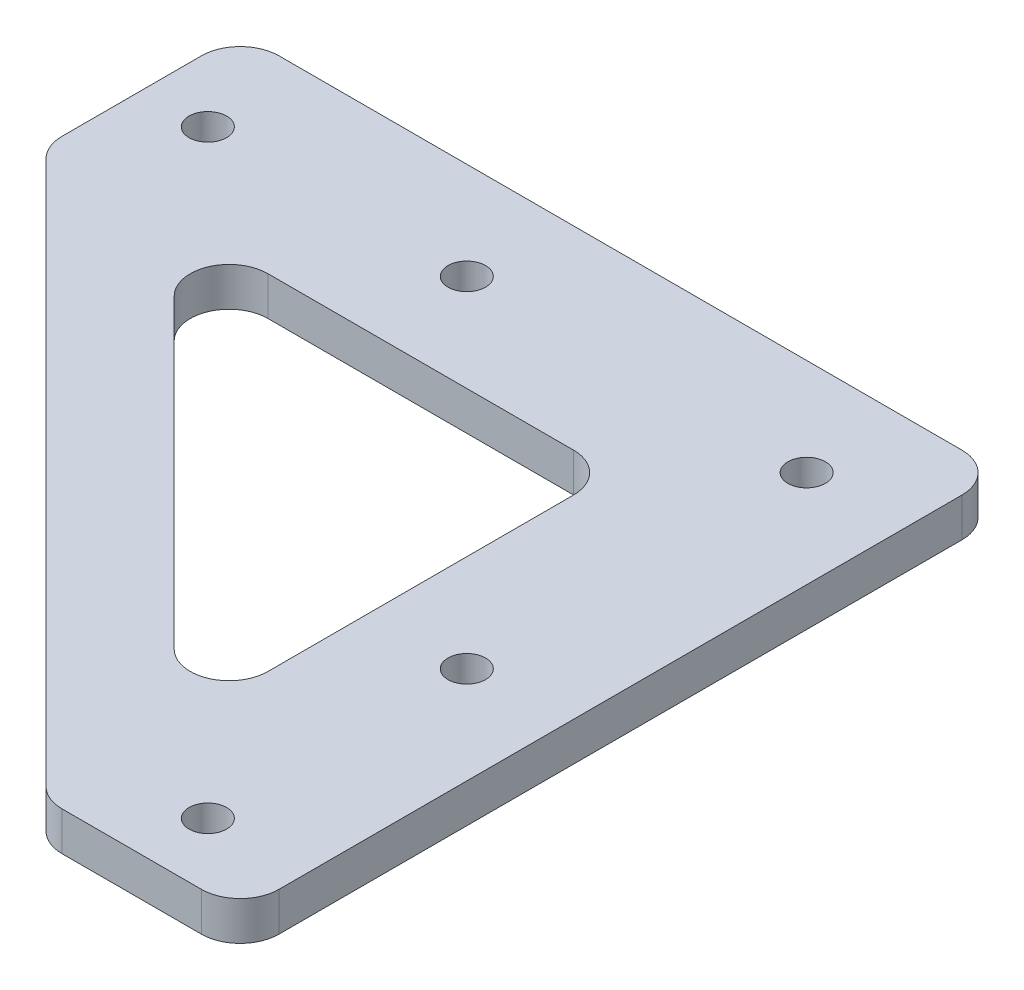
ISO-10303-21;
HEADER;
FILE_DESCRIPTION(('STEP AP214'),'2;1');
FILE_NAME('part.step','',(''),(''),'','','');
FILE_SCHEMA(('AUTOMOTIVE_DESIGN { 1 0 10303 214 1 1 1 1 }'));
ENDSEC;
DATA;
#1=APPLICATION_CONTEXT('core data for automotive mechanical design processes');
#2=APPLICATION_PROTOCOL_DEFINITION('international standard','automotive_design',2000,#1);
#3=PRODUCT_CONTEXT('',#1,'mechanical');
#4=PRODUCT('Part','Part','',(#3));
#5=PRODUCT_RELATED_PRODUCT_CATEGORY('part','',(#4));
#6=PRODUCT_DEFINITION_FORMATION('','',#4);
#7=PRODUCT_DEFINITION_CONTEXT('part definition',#1,'design');
#8=PRODUCT_DEFINITION('design','',#6,#7);
#9=PRODUCT_DEFINITION_SHAPE('','',#8);
#10=(LENGTH_UNIT() NAMED_UNIT(*) SI_UNIT(.MILLI.,.METRE.));
#11=(NAMED_UNIT(*) PLANE_ANGLE_UNIT() SI_UNIT($,.RADIAN.));
#12=(NAMED_UNIT(*) SI_UNIT($,.STERADIAN.) SOLID_ANGLE_UNIT());
#13=UNCERTAINTY_MEASURE_WITH_UNIT(LENGTH_MEASURE(1.E-05),#10,'distance_accuracy_value','');
#14=(GEOMETRIC_REPRESENTATION_CONTEXT(3) GLOBAL_UNCERTAINTY_ASSIGNED_CONTEXT((#13)) GLOBAL_UNIT_ASSIGNED_CONTEXT((#10,
#11,#12)) REPRESENTATION_CONTEXT('',''));
#15=CARTESIAN_POINT('',(0.,0.,0.));
#16=DIRECTION('',(0.,0.,1.));
#17=DIRECTION('',(1.,0.,0.));
#18=AXIS2_PLACEMENT_3D('',#15,#16,#17);
#19=CARTESIAN_POINT('',(0.,3.,0.));
#20=DIRECTION('',(0.,-1.,0.));
#21=DIRECTION('',(0.,0.,-1.));
#22=AXIS2_PLACEMENT_3D('',#19,#20,#21);
#23=PLANE('',#22);
#24=DIRECTION('',(0.,0.,1.));
#25=VECTOR('',#24,1.);
#26=CARTESIAN_POINT('',(-7.5,3.,58.75));
#27=LINE('',#26,#25);
#28=CARTESIAN_POINT('',(-7.5,3.,18.));
#29=VERTEX_POINT('',#28);
#30=CARTESIAN_POINT('',(-7.5,3.,41.607864376269));
#31=VERTEX_POINT('',#30);
#32=EDGE_CURVE('E175',#29,#31,#27,.T.);
#33=ORIENTED_EDGE('',*,*,#32,.T.);
#34=CARTESIAN_POINT('',(-10.5,3.,41.607864376269));
#35=DIRECTION('',(0.,-1.,0.));
#36=DIRECTION('',(0.,0.,-1.));
#37=AXIS2_PLACEMENT_3D('',#34,#35,#36);
#38=CIRCLE('',#37,3.);
#39=CARTESIAN_POINT('',(-12.6213203435596,3.,43.7291847198287));
#40=VERTEX_POINT('',#39);
#41=EDGE_CURVE('E251',#31,#40,#38,.T.);
#42=ORIENTED_EDGE('',*,*,#41,.T.);
#43=DIRECTION('',(-0.707106781186548,0.,-0.707106781186548));
#44=VECTOR('',#43,1.);
#45=CARTESIAN_POINT('',(-7.5,3.,48.8505050633883));
#46=LINE('',#45,#44);
#47=CARTESIAN_POINT('',(-36.2291847198287,3.,20.1213203435596));
#48=VERTEX_POINT('',#47);
#49=EDGE_CURVE('E259',#40,#48,#46,.T.);
#50=ORIENTED_EDGE('',*,*,#49,.T.);
#51=CARTESIAN_POINT('',(-34.1078643762691,3.,18.));
#52=DIRECTION('',(0.,-1.,0.));
#53=DIRECTION('',(0.,0.,-1.));
#54=AXIS2_PLACEMENT_3D('',#51,#52,#53);
#55=CIRCLE('',#54,3.);
#56=CARTESIAN_POINT('',(-34.1078643762691,3.,15.));
#57=VERTEX_POINT('',#56);
#58=EDGE_CURVE('E49',#48,#57,#55,.T.);
#59=ORIENTED_EDGE('',*,*,#58,.T.);
#60=DIRECTION('',(1.,0.,0.));
#61=VECTOR('',#60,1.);
#62=CARTESIAN_POINT('',(-7.5,3.,15.));
#63=LINE('',#62,#61);
#64=CARTESIAN_POINT('',(-10.5,3.,15.));
#65=VERTEX_POINT('',#64);
#66=EDGE_CURVE('E257',#57,#65,#63,.T.);
#67=ORIENTED_EDGE('',*,*,#66,.T.);
#68=CARTESIAN_POINT('',(-10.5,3.,18.));
#69=DIRECTION('',(0.,-1.,0.));
#70=DIRECTION('',(0.,0.,-1.));
#71=AXIS2_PLACEMENT_3D('',#68,#69,#70);
#72=CIRCLE('',#71,3.);
#73=EDGE_CURVE('E164',#65,#29,#72,.T.);
#74=ORIENTED_EDGE('',*,*,#73,.T.);
#75=EDGE_LOOP('',(#33,#42,#50,#59,#67,#74));
#76=FACE_BOUND('',#75,.T.);
#77=DIRECTION('',(0.,0.,1.));
#78=VECTOR('',#77,1.);
#79=CARTESIAN_POINT('',(-51.25,3.,15.));
#80=LINE('',#79,#78);
#81=CARTESIAN_POINT('',(-51.25,3.,3.));
#82=VERTEX_POINT('',#81);
#83=CARTESIAN_POINT('',(-51.25,3.,13.7573593128807));
#84=VERTEX_POINT('',#83);
#85=EDGE_CURVE('E198',#82,#84,#80,.T.);
#86=ORIENTED_EDGE('',*,*,#85,.T.);
#87=CARTESIAN_POINT('',(-48.25,3.,13.7573593128807));
#88=DIRECTION('',(0.,-1.,0.));
#89=DIRECTION('',(0.,0.,-1.));
#90=AXIS2_PLACEMENT_3D('',#87,#88,#89);
#91=CIRCLE('',#90,3.);
#92=CARTESIAN_POINT('',(-50.3713203435596,3.,15.8786796564404));
#93=VERTEX_POINT('',#92);
#94=EDGE_CURVE('E235',#84,#93,#91,.F.);
#95=ORIENTED_EDGE('',*,*,#94,.T.);
#96=DIRECTION('',(0.707106781186547,0.,0.707106781186547));
#97=VECTOR('',#96,1.);
#98=CARTESIAN_POINT('',(-51.25,3.,15.));
#99=LINE('',#98,#97);
#100=CARTESIAN_POINT('',(-8.37867965644038,3.,57.8713203435596));
#101=VERTEX_POINT('',#100);
#102=EDGE_CURVE('E332',#93,#101,#99,.T.);
#103=ORIENTED_EDGE('',*,*,#102,.T.);
#104=CARTESIAN_POINT('',(-6.25735931288072,3.,55.75));
#105=DIRECTION('',(0.,-1.,0.));
#106=DIRECTION('',(0.,0.,-1.));
#107=AXIS2_PLACEMENT_3D('',#104,#105,#106);
#108=CIRCLE('',#107,3.);
#109=CARTESIAN_POINT('',(-6.25735931288072,3.,58.75));
#110=VERTEX_POINT('',#109);
#111=EDGE_CURVE('E233',#101,#110,#108,.F.);
#112=ORIENTED_EDGE('',*,*,#111,.T.);
#113=DIRECTION('',(1.,0.,0.));
#114=VECTOR('',#113,1.);
#115=CARTESIAN_POINT('',(7.5,3.,58.75));
#116=LINE('',#115,#114);
#117=CARTESIAN_POINT('',(4.5,3.,58.75));
#118=VERTEX_POINT('',#117);
#119=EDGE_CURVE('E312',#110,#118,#116,.T.);
#120=ORIENTED_EDGE('',*,*,#119,.T.);
#121=CARTESIAN_POINT('',(4.5,3.,55.75));
#122=DIRECTION('',(0.,-1.,0.));
#123=DIRECTION('',(0.,0.,-1.));
#124=AXIS2_PLACEMENT_3D('',#121,#122,#123);
#125=CIRCLE('',#124,3.);
#126=CARTESIAN_POINT('',(7.5,3.,55.75));
#127=VERTEX_POINT('',#126);
#128=EDGE_CURVE('E231',#118,#127,#125,.F.);
#129=ORIENTED_EDGE('',*,*,#128,.T.);
#130=DIRECTION('',(0.,0.,-1.));
#131=VECTOR('',#130,1.);
#132=CARTESIAN_POINT('',(7.5,3.,15.));
#133=LINE('',#132,#131);
#134=CARTESIAN_POINT('',(7.5,3.,3.));
#135=VERTEX_POINT('',#134);
#136=EDGE_CURVE('E315',#127,#135,#133,.T.);
#137=ORIENTED_EDGE('',*,*,#136,.T.);
#138=CARTESIAN_POINT('',(4.5,3.,3.));
#139=DIRECTION('',(0.,-1.,0.));
#140=DIRECTION('',(0.,0.,-1.));
#141=AXIS2_PLACEMENT_3D('',#138,#139,#140);
#142=CIRCLE('',#141,3.);
#143=CARTESIAN_POINT('',(4.5,3.,0.));
#144=VERTEX_POINT('',#143);
#145=EDGE_CURVE('E63',#135,#144,#142,.F.);
#146=ORIENTED_EDGE('',*,*,#145,.T.);
#147=DIRECTION('',(-1.,0.,0.));
#148=VECTOR('',#147,1.);
#149=CARTESIAN_POINT('',(0.,3.,0.));
#150=LINE('',#149,#148);
#151=CARTESIAN_POINT('',(-48.25,3.,0.));
#152=VERTEX_POINT('',#151);
#153=EDGE_CURVE('E199',#144,#152,#150,.T.);
#154=ORIENTED_EDGE('',*,*,#153,.T.);
#155=CARTESIAN_POINT('',(-48.25,3.,3.));
#156=DIRECTION('',(0.,-1.,0.));
#157=DIRECTION('',(0.,0.,-1.));
#158=AXIS2_PLACEMENT_3D('',#155,#156,#157);
#159=CIRCLE('',#158,3.);
#160=EDGE_CURVE('E228',#152,#82,#159,.F.);
#161=ORIENTED_EDGE('',*,*,#160,.T.);
#162=EDGE_LOOP('',(#86,#95,#103,#112,#120,#129,#137,#146,#154,#161));
#163=FACE_BOUND('',#162,.T.);
#164=CARTESIAN_POINT('',(0.,3.,7.5));
#165=DIRECTION('',(0.,1.,0.));
#166=DIRECTION('',(0.,0.,1.));
#167=AXIS2_PLACEMENT_3D('',#164,#165,#166);
#168=CIRCLE('',#167,1.45);
#169=CARTESIAN_POINT('',(0.,3.,8.95));
#170=VERTEX_POINT('',#169);
#171=EDGE_CURVE('E304',#170,#170,#168,.T.);
#172=ORIENTED_EDGE('',*,*,#171,.F.);
#173=EDGE_LOOP('',(#172));
#174=FACE_BOUND('',#173,.T.);
#175=CARTESIAN_POINT('',(0.,3.,33.75));
#176=DIRECTION('',(0.,1.,0.));
#177=DIRECTION('',(0.,0.,1.));
#178=AXIS2_PLACEMENT_3D('',#175,#176,#177);
#179=CIRCLE('',#178,1.45);
#180=CARTESIAN_POINT('',(0.,3.,35.2));
#181=VERTEX_POINT('',#180);
#182=EDGE_CURVE('E298',#181,#181,#179,.T.);
#183=ORIENTED_EDGE('',*,*,#182,.F.);
#184=EDGE_LOOP('',(#183));
#185=FACE_BOUND('',#184,.T.);
#186=CARTESIAN_POINT('',(0.,3.,53.75));
#187=DIRECTION('',(0.,1.,0.));
#188=DIRECTION('',(0.,0.,1.));
#189=AXIS2_PLACEMENT_3D('',#186,#187,#188);
#190=CIRCLE('',#189,1.45);
#191=CARTESIAN_POINT('',(0.,3.,55.2));
#192=VERTEX_POINT('',#191);
#193=EDGE_CURVE('E292',#192,#192,#190,.T.);
#194=ORIENTED_EDGE('',*,*,#193,.F.);
#195=EDGE_LOOP('',(#194));
#196=FACE_BOUND('',#195,.T.);
#197=CARTESIAN_POINT('',(-26.25,3.,7.5));
#198=DIRECTION('',(0.,1.,0.));
#199=DIRECTION('',(0.,0.,1.));
#200=AXIS2_PLACEMENT_3D('',#197,#198,#199);
#201=CIRCLE('',#200,1.45);
#202=CARTESIAN_POINT('',(-26.25,3.,8.95));
#203=VERTEX_POINT('',#202);
#204=EDGE_CURVE('E286',#203,#203,#201,.T.);
#205=ORIENTED_EDGE('',*,*,#204,.F.);
#206=EDGE_LOOP('',(#205));
#207=FACE_BOUND('',#206,.T.);
#208=CARTESIAN_POINT('',(-46.25,3.,7.5));
#209=DIRECTION('',(0.,1.,0.));
#210=DIRECTION('',(0.,0.,1.));
#211=AXIS2_PLACEMENT_3D('',#208,#209,#210);
#212=CIRCLE('',#211,1.45);
#213=CARTESIAN_POINT('',(-46.25,3.,8.95));
#214=VERTEX_POINT('',#213);
#215=EDGE_CURVE('E277',#214,#214,#212,.T.);
#216=ORIENTED_EDGE('',*,*,#215,.F.);
#217=EDGE_LOOP('',(#216));
#218=FACE_BOUND('',#217,.T.);
#219=ADVANCED_FACE('F41',(#76,#163,#174,#185,#196,#207,#218),#23,.F.);
#220=CARTESIAN_POINT('',(0.,0.,0.));
#221=DIRECTION('',(0.,-1.,0.));
#222=DIRECTION('',(0.,0.,-1.));
#223=AXIS2_PLACEMENT_3D('',#220,#221,#222);
#224=PLANE('',#223);
#225=DIRECTION('',(0.707106781186547,0.,0.707106781186548));
#226=VECTOR('',#225,1.);
#227=CARTESIAN_POINT('',(-51.25,0.,15.));
#228=LINE('',#227,#226);
#229=CARTESIAN_POINT('',(-50.3713203435596,0.,15.8786796564404));
#230=VERTEX_POINT('',#229);
#231=CARTESIAN_POINT('',(-8.37867965644037,0.,57.8713203435596));
#232=VERTEX_POINT('',#231);
#233=EDGE_CURVE('E274',#230,#232,#228,.T.);
#234=ORIENTED_EDGE('',*,*,#233,.F.);
#235=CARTESIAN_POINT('',(-48.25,0.,13.7573593128807));
#236=DIRECTION('',(0.,-1.,0.));
#237=DIRECTION('',(0.,0.,-1.));
#238=AXIS2_PLACEMENT_3D('',#235,#236,#237);
#239=CIRCLE('',#238,3.);
#240=CARTESIAN_POINT('',(-51.25,0.,13.7573593128807));
#241=VERTEX_POINT('',#240);
#242=EDGE_CURVE('E221',#230,#241,#239,.T.);
#243=ORIENTED_EDGE('',*,*,#242,.T.);
#244=DIRECTION('',(0.,0.,1.));
#245=VECTOR('',#244,1.);
#246=CARTESIAN_POINT('',(-51.25,0.,15.));
#247=LINE('',#246,#245);
#248=CARTESIAN_POINT('',(-51.25,0.,3.));
#249=VERTEX_POINT('',#248);
#250=EDGE_CURVE('E190',#249,#241,#247,.T.);
#251=ORIENTED_EDGE('',*,*,#250,.F.);
#252=CARTESIAN_POINT('',(-48.25,0.,3.));
#253=DIRECTION('',(0.,-1.,0.));
#254=DIRECTION('',(0.,0.,-1.));
#255=AXIS2_PLACEMENT_3D('',#252,#253,#254);
#256=CIRCLE('',#255,3.);
#257=CARTESIAN_POINT('',(-48.25,0.,0.));
#258=VERTEX_POINT('',#257);
#259=EDGE_CURVE('E213',#249,#258,#256,.T.);
#260=ORIENTED_EDGE('',*,*,#259,.T.);
#261=DIRECTION('',(-1.,0.,0.));
#262=VECTOR('',#261,1.);
#263=CARTESIAN_POINT('',(-51.25,0.,0.));
#264=LINE('',#263,#262);
#265=CARTESIAN_POINT('',(4.49999999999998,0.,0.));
#266=VERTEX_POINT('',#265);
#267=EDGE_CURVE('E196',#266,#258,#264,.T.);
#268=ORIENTED_EDGE('',*,*,#267,.F.);
#269=CARTESIAN_POINT('',(4.5,0.,3.));
#270=DIRECTION('',(0.,-1.,0.));
#271=DIRECTION('',(0.,0.,-1.));
#272=AXIS2_PLACEMENT_3D('',#269,#270,#271);
#273=CIRCLE('',#272,3.);
#274=CARTESIAN_POINT('',(7.5,0.,3.));
#275=VERTEX_POINT('',#274);
#276=EDGE_CURVE('E215',#266,#275,#273,.T.);
#277=ORIENTED_EDGE('',*,*,#276,.T.);
#278=DIRECTION('',(0.,0.,-1.));
#279=VECTOR('',#278,1.);
#280=CARTESIAN_POINT('',(7.5,0.,15.));
#281=LINE('',#280,#279);
#282=CARTESIAN_POINT('',(7.5,0.,55.75));
#283=VERTEX_POINT('',#282);
#284=EDGE_CURVE('E188',#283,#275,#281,.T.);
#285=ORIENTED_EDGE('',*,*,#284,.F.);
#286=CARTESIAN_POINT('',(4.5,0.,55.75));
#287=DIRECTION('',(0.,-1.,0.));
#288=DIRECTION('',(0.,0.,-1.));
#289=AXIS2_PLACEMENT_3D('',#286,#287,#288);
#290=CIRCLE('',#289,3.);
#291=CARTESIAN_POINT('',(4.5,0.,58.75));
#292=VERTEX_POINT('',#291);
#293=EDGE_CURVE('E217',#283,#292,#290,.T.);
#294=ORIENTED_EDGE('',*,*,#293,.T.);
#295=DIRECTION('',(1.,0.,0.));
#296=VECTOR('',#295,1.);
#297=CARTESIAN_POINT('',(7.5,0.,58.75));
#298=LINE('',#297,#296);
#299=CARTESIAN_POINT('',(-6.25735931288072,0.,58.75));
#300=VERTEX_POINT('',#299);
#301=EDGE_CURVE('E184',#300,#292,#298,.T.);
#302=ORIENTED_EDGE('',*,*,#301,.F.);
#303=CARTESIAN_POINT('',(-6.25735931288072,0.,55.75));
#304=DIRECTION('',(0.,-1.,0.));
#305=DIRECTION('',(0.,0.,-1.));
#306=AXIS2_PLACEMENT_3D('',#303,#304,#305);
#307=CIRCLE('',#306,3.);
#308=EDGE_CURVE('E219',#300,#232,#307,.T.);
#309=ORIENTED_EDGE('',*,*,#308,.T.);
#310=EDGE_LOOP('',(#234,#243,#251,#260,#268,#277,#285,#294,#302,#309));
#311=FACE_BOUND('',#310,.T.);
#312=DIRECTION('',(1.,0.,0.));
#313=VECTOR('',#312,1.);
#314=CARTESIAN_POINT('',(-7.5,0.,15.));
#315=LINE('',#314,#313);
#316=CARTESIAN_POINT('',(-34.1078643762691,0.,15.));
#317=VERTEX_POINT('',#316);
#318=CARTESIAN_POINT('',(-10.5,0.,15.));
#319=VERTEX_POINT('',#318);
#320=EDGE_CURVE('E185',#317,#319,#315,.T.);
#321=ORIENTED_EDGE('',*,*,#320,.F.);
#322=CARTESIAN_POINT('',(-34.1078643762691,0.,18.));
#323=DIRECTION('',(0.,-1.,0.));
#324=DIRECTION('',(0.,0.,-1.));
#325=AXIS2_PLACEMENT_3D('',#322,#323,#324);
#326=CIRCLE('',#325,3.);
#327=CARTESIAN_POINT('',(-36.2291847198287,0.,20.1213203435596));
#328=VERTEX_POINT('',#327);
#329=EDGE_CURVE('E11',#317,#328,#326,.F.);
#330=ORIENTED_EDGE('',*,*,#329,.T.);
#331=DIRECTION('',(-0.707106781186548,0.,-0.707106781186548));
#332=VECTOR('',#331,1.);
#333=CARTESIAN_POINT('',(-7.5,0.,48.8505050633883));
#334=LINE('',#333,#332);
#335=CARTESIAN_POINT('',(-12.6213203435596,0.,43.7291847198287));
#336=VERTEX_POINT('',#335);
#337=EDGE_CURVE('E269',#336,#328,#334,.T.);
#338=ORIENTED_EDGE('',*,*,#337,.F.);
#339=CARTESIAN_POINT('',(-10.5,0.,41.607864376269));
#340=DIRECTION('',(0.,-1.,0.));
#341=DIRECTION('',(0.,0.,-1.));
#342=AXIS2_PLACEMENT_3D('',#339,#340,#341);
#343=CIRCLE('',#342,3.);
#344=CARTESIAN_POINT('',(-7.5,0.,41.607864376269));
#345=VERTEX_POINT('',#344);
#346=EDGE_CURVE('E183',#336,#345,#343,.F.);
#347=ORIENTED_EDGE('',*,*,#346,.T.);
#348=DIRECTION('',(0.,0.,1.));
#349=VECTOR('',#348,1.);
#350=CARTESIAN_POINT('',(-7.5,0.,58.75));
#351=LINE('',#350,#349);
#352=CARTESIAN_POINT('',(-7.5,0.,18.));
#353=VERTEX_POINT('',#352);
#354=EDGE_CURVE('E172',#353,#345,#351,.T.);
#355=ORIENTED_EDGE('',*,*,#354,.F.);
#356=CARTESIAN_POINT('',(-10.5,0.,18.));
#357=DIRECTION('',(0.,-1.,0.));
#358=DIRECTION('',(0.,0.,-1.));
#359=AXIS2_PLACEMENT_3D('',#356,#357,#358);
#360=CIRCLE('',#359,3.);
#361=EDGE_CURVE('E154',#353,#319,#360,.F.);
#362=ORIENTED_EDGE('',*,*,#361,.T.);
#363=EDGE_LOOP('',(#321,#330,#338,#347,#355,#362));
#364=FACE_BOUND('',#363,.T.);
#365=CARTESIAN_POINT('',(-26.25,0.,7.5));
#366=DIRECTION('',(0.,1.,0.));
#367=DIRECTION('',(0.,0.,1.));
#368=AXIS2_PLACEMENT_3D('',#365,#366,#367);
#369=CIRCLE('',#368,1.45);
#370=CARTESIAN_POINT('',(-26.25,0.,8.95));
#371=VERTEX_POINT('',#370);
#372=EDGE_CURVE('E284',#371,#371,#369,.T.);
#373=ORIENTED_EDGE('',*,*,#372,.T.);
#374=EDGE_LOOP('',(#373));
#375=FACE_BOUND('',#374,.T.);
#376=CARTESIAN_POINT('',(0.,0.,33.75));
#377=DIRECTION('',(0.,1.,0.));
#378=DIRECTION('',(0.,0.,1.));
#379=AXIS2_PLACEMENT_3D('',#376,#377,#378);
#380=CIRCLE('',#379,1.45);
#381=CARTESIAN_POINT('',(0.,0.,35.2));
#382=VERTEX_POINT('',#381);
#383=EDGE_CURVE('E295',#382,#382,#380,.T.);
#384=ORIENTED_EDGE('',*,*,#383,.T.);
#385=EDGE_LOOP('',(#384));
#386=FACE_BOUND('',#385,.T.);
#387=CARTESIAN_POINT('',(0.,0.,7.5));
#388=DIRECTION('',(0.,1.,0.));
#389=DIRECTION('',(0.,0.,1.));
#390=AXIS2_PLACEMENT_3D('',#387,#388,#389);
#391=CIRCLE('',#390,1.45);
#392=CARTESIAN_POINT('',(0.,0.,8.95));
#393=VERTEX_POINT('',#392);
#394=EDGE_CURVE('E301',#393,#393,#391,.T.);
#395=ORIENTED_EDGE('',*,*,#394,.T.);
#396=EDGE_LOOP('',(#395));
#397=FACE_BOUND('',#396,.T.);
#398=CARTESIAN_POINT('',(0.,0.,53.75));
#399=DIRECTION('',(0.,1.,0.));
#400=DIRECTION('',(0.,0.,1.));
#401=AXIS2_PLACEMENT_3D('',#398,#399,#400);
#402=CIRCLE('',#401,1.45);
#403=CARTESIAN_POINT('',(0.,0.,55.2));
#404=VERTEX_POINT('',#403);
#405=EDGE_CURVE('E289',#404,#404,#402,.T.);
#406=ORIENTED_EDGE('',*,*,#405,.T.);
#407=EDGE_LOOP('',(#406));
#408=FACE_BOUND('',#407,.T.);
#409=CARTESIAN_POINT('',(-46.25,0.,7.5));
#410=DIRECTION('',(0.,1.,0.));
#411=DIRECTION('',(0.,0.,1.));
#412=AXIS2_PLACEMENT_3D('',#409,#410,#411);
#413=CIRCLE('',#412,1.45);
#414=CARTESIAN_POINT('',(-46.25,0.,8.95));
#415=VERTEX_POINT('',#414);
#416=EDGE_CURVE('E273',#415,#415,#413,.T.);
#417=ORIENTED_EDGE('',*,*,#416,.T.);
#418=EDGE_LOOP('',(#417));
#419=FACE_BOUND('',#418,.T.);
#420=ADVANCED_FACE('F179',(#311,#364,#375,#386,#397,#408,#419),#224,.T.);
#421=CARTESIAN_POINT('',(-51.25,3.,15.));
#422=DIRECTION('',(1.,0.,0.));
#423=DIRECTION('',(0.,0.,-1.));
#424=AXIS2_PLACEMENT_3D('',#421,#422,#423);
#425=PLANE('',#424);
#426=ORIENTED_EDGE('',*,*,#250,.T.);
#427=DIRECTION('',(0.,-1.,0.));
#428=VECTOR('',#427,1.);
#429=CARTESIAN_POINT('',(-51.25,3.,13.7573593128807));
#430=LINE('',#429,#428);
#431=EDGE_CURVE('E226',#241,#84,#430,.F.);
#432=ORIENTED_EDGE('',*,*,#431,.T.);
#433=ORIENTED_EDGE('',*,*,#85,.F.);
#434=DIRECTION('',(0.,-1.,0.));
#435=VECTOR('',#434,1.);
#436=CARTESIAN_POINT('',(-51.25,3.,3.));
#437=LINE('',#436,#435);
#438=EDGE_CURVE('E223',#82,#249,#437,.T.);
#439=ORIENTED_EDGE('',*,*,#438,.T.);
#440=EDGE_LOOP('',(#426,#432,#433,#439));
#441=FACE_BOUND('',#440,.T.);
#442=ADVANCED_FACE('F321',(#441),#425,.F.);
#443=CARTESIAN_POINT('',(-7.5,3.,15.));
#444=DIRECTION('',(0.,0.,-1.));
#445=DIRECTION('',(-1.,0.,0.));
#446=AXIS2_PLACEMENT_3D('',#443,#444,#445);
#447=PLANE('',#446);
#448=ORIENTED_EDGE('',*,*,#320,.T.);
#449=DIRECTION('',(0.,-1.,0.));
#450=VECTOR('',#449,1.);
#451=CARTESIAN_POINT('',(-10.5,3.,15.));
#452=LINE('',#451,#450);
#453=EDGE_CURVE('E159',#319,#65,#452,.F.);
#454=ORIENTED_EDGE('',*,*,#453,.T.);
#455=ORIENTED_EDGE('',*,*,#66,.F.);
#456=DIRECTION('',(0.,1.,0.));
#457=VECTOR('',#456,1.);
#458=CARTESIAN_POINT('',(-34.1078643762691,3.,15.));
#459=LINE('',#458,#457);
#460=EDGE_CURVE('E176',#57,#317,#459,.F.);
#461=ORIENTED_EDGE('',*,*,#460,.T.);
#462=EDGE_LOOP('',(#448,#454,#455,#461));
#463=FACE_BOUND('',#462,.T.);
#464=ADVANCED_FACE('F264',(#463),#447,.F.);
#465=CARTESIAN_POINT('',(-7.5,3.,58.75));
#466=DIRECTION('',(1.,0.,0.));
#467=DIRECTION('',(0.,0.,-1.));
#468=AXIS2_PLACEMENT_3D('',#465,#466,#467);
#469=PLANE('',#468);
#470=ORIENTED_EDGE('',*,*,#32,.F.);
#471=DIRECTION('',(0.,-1.,0.));
#472=VECTOR('',#471,1.);
#473=CARTESIAN_POINT('',(-7.5,0.,18.));
#474=LINE('',#473,#472);
#475=EDGE_CURVE('E158',#29,#353,#474,.T.);
#476=ORIENTED_EDGE('',*,*,#475,.T.);
#477=ORIENTED_EDGE('',*,*,#354,.T.);
#478=DIRECTION('',(0.,1.,0.));
#479=VECTOR('',#478,1.);
#480=CARTESIAN_POINT('',(-7.5,3.,41.607864376269));
#481=LINE('',#480,#479);
#482=EDGE_CURVE('E177',#345,#31,#481,.T.);
#483=ORIENTED_EDGE('',*,*,#482,.T.);
#484=EDGE_LOOP('',(#470,#476,#477,#483));
#485=FACE_BOUND('',#484,.T.);
#486=ADVANCED_FACE('F170',(#485),#469,.F.);
#487=CARTESIAN_POINT('',(7.5,3.,58.75));
#488=DIRECTION('',(0.,0.,-1.));
#489=DIRECTION('',(-1.,0.,0.));
#490=AXIS2_PLACEMENT_3D('',#487,#488,#489);
#491=PLANE('',#490);
#492=ORIENTED_EDGE('',*,*,#119,.F.);
#493=DIRECTION('',(0.,-1.,0.));
#494=VECTOR('',#493,1.);
#495=CARTESIAN_POINT('',(-6.25735931288072,0.,58.75));
#496=LINE('',#495,#494);
#497=EDGE_CURVE('E239',#110,#300,#496,.T.);
#498=ORIENTED_EDGE('',*,*,#497,.T.);
#499=ORIENTED_EDGE('',*,*,#301,.T.);
#500=DIRECTION('',(0.,-1.,0.));
#501=VECTOR('',#500,1.);
#502=CARTESIAN_POINT('',(4.5,3.,58.75));
#503=LINE('',#502,#501);
#504=EDGE_CURVE('E237',#292,#118,#503,.F.);
#505=ORIENTED_EDGE('',*,*,#504,.T.);
#506=EDGE_LOOP('',(#492,#498,#499,#505));
#507=FACE_BOUND('',#506,.T.);
#508=ADVANCED_FACE('F345',(#507),#491,.F.);
#509=CARTESIAN_POINT('',(7.5,3.,15.));
#510=DIRECTION('',(-1.,0.,0.));
#511=DIRECTION('',(0.,0.,1.));
#512=AXIS2_PLACEMENT_3D('',#509,#510,#511);
#513=PLANE('',#512);
#514=ORIENTED_EDGE('',*,*,#136,.F.);
#515=DIRECTION('',(0.,-1.,0.));
#516=VECTOR('',#515,1.);
#517=CARTESIAN_POINT('',(7.5,3.,55.75));
#518=LINE('',#517,#516);
#519=EDGE_CURVE('E245',#127,#283,#518,.T.);
#520=ORIENTED_EDGE('',*,*,#519,.T.);
#521=ORIENTED_EDGE('',*,*,#284,.T.);
#522=DIRECTION('',(0.,1.,0.));
#523=VECTOR('',#522,1.);
#524=CARTESIAN_POINT('',(7.5,3.,3.));
#525=LINE('',#524,#523);
#526=EDGE_CURVE('E242',#275,#135,#525,.T.);
#527=ORIENTED_EDGE('',*,*,#526,.T.);
#528=EDGE_LOOP('',(#514,#520,#521,#527));
#529=FACE_BOUND('',#528,.T.);
#530=ADVANCED_FACE('F353',(#529),#513,.F.);
#531=CARTESIAN_POINT('',(-51.25,3.,0.));
#532=DIRECTION('',(0.,0.,1.));
#533=DIRECTION('',(1.,0.,0.));
#534=AXIS2_PLACEMENT_3D('',#531,#532,#533);
#535=PLANE('',#534);
#536=ORIENTED_EDGE('',*,*,#153,.F.);
#537=DIRECTION('',(0.,1.,0.));
#538=VECTOR('',#537,1.);
#539=CARTESIAN_POINT('',(4.5,3.,0.));
#540=LINE('',#539,#538);
#541=EDGE_CURVE('E165',#144,#266,#540,.F.);
#542=ORIENTED_EDGE('',*,*,#541,.T.);
#543=ORIENTED_EDGE('',*,*,#267,.T.);
#544=DIRECTION('',(0.,-1.,0.));
#545=VECTOR('',#544,1.);
#546=CARTESIAN_POINT('',(-48.25,3.,0.));
#547=LINE('',#546,#545);
#548=EDGE_CURVE('E56',#258,#152,#547,.F.);
#549=ORIENTED_EDGE('',*,*,#548,.T.);
#550=EDGE_LOOP('',(#536,#542,#543,#549));
#551=FACE_BOUND('',#550,.T.);
#552=ADVANCED_FACE('F361',(#551),#535,.F.);
#553=CARTESIAN_POINT('',(0.,3.,7.5));
#554=DIRECTION('',(0.,-1.,0.));
#555=DIRECTION('',(0.,0.,-1.));
#556=AXIS2_PLACEMENT_3D('',#553,#554,#555);
#557=CYLINDRICAL_SURFACE('',#556,1.45);
#558=ORIENTED_EDGE('',*,*,#171,.T.);
#559=EDGE_LOOP('',(#558));
#560=FACE_BOUND('',#559,.T.);
#561=ORIENTED_EDGE('',*,*,#394,.F.);
#562=EDGE_LOOP('',(#561));
#563=FACE_BOUND('',#562,.T.);
#564=ADVANCED_FACE('F376',(#560,#563),#557,.F.);
#565=CARTESIAN_POINT('',(0.,3.,33.75));
#566=DIRECTION('',(0.,-1.,0.));
#567=DIRECTION('',(0.,0.,-1.));
#568=AXIS2_PLACEMENT_3D('',#565,#566,#567);
#569=CYLINDRICAL_SURFACE('',#568,1.45);
#570=ORIENTED_EDGE('',*,*,#182,.T.);
#571=EDGE_LOOP('',(#570));
#572=FACE_BOUND('',#571,.T.);
#573=ORIENTED_EDGE('',*,*,#383,.F.);
#574=EDGE_LOOP('',(#573));
#575=FACE_BOUND('',#574,.T.);
#576=ADVANCED_FACE('F486',(#572,#575),#569,.F.);
#577=CARTESIAN_POINT('',(0.,3.,53.75));
#578=DIRECTION('',(0.,-1.,0.));
#579=DIRECTION('',(0.,0.,-1.));
#580=AXIS2_PLACEMENT_3D('',#577,#578,#579);
#581=CYLINDRICAL_SURFACE('',#580,1.45);
#582=ORIENTED_EDGE('',*,*,#193,.T.);
#583=EDGE_LOOP('',(#582));
#584=FACE_BOUND('',#583,.T.);
#585=ORIENTED_EDGE('',*,*,#405,.F.);
#586=EDGE_LOOP('',(#585));
#587=FACE_BOUND('',#586,.T.);
#588=ADVANCED_FACE('F477',(#584,#587),#581,.F.);
#589=CARTESIAN_POINT('',(-26.25,3.,7.5));
#590=DIRECTION('',(0.,-1.,0.));
#591=DIRECTION('',(0.,0.,-1.));
#592=AXIS2_PLACEMENT_3D('',#589,#590,#591);
#593=CYLINDRICAL_SURFACE('',#592,1.45);
#594=ORIENTED_EDGE('',*,*,#204,.T.);
#595=EDGE_LOOP('',(#594));
#596=FACE_BOUND('',#595,.T.);
#597=ORIENTED_EDGE('',*,*,#372,.F.);
#598=EDGE_LOOP('',(#597));
#599=FACE_BOUND('',#598,.T.);
#600=ADVANCED_FACE('F467',(#596,#599),#593,.F.);
#601=CARTESIAN_POINT('',(-46.25,3.,7.5));
#602=DIRECTION('',(0.,-1.,0.));
#603=DIRECTION('',(0.,0.,-1.));
#604=AXIS2_PLACEMENT_3D('',#601,#602,#603);
#605=CYLINDRICAL_SURFACE('',#604,1.45);
#606=ORIENTED_EDGE('',*,*,#215,.T.);
#607=EDGE_LOOP('',(#606));
#608=FACE_BOUND('',#607,.T.);
#609=ORIENTED_EDGE('',*,*,#416,.F.);
#610=EDGE_LOOP('',(#609));
#611=FACE_BOUND('',#610,.T.);
#612=ADVANCED_FACE('F459',(#608,#611),#605,.F.);
#613=CARTESIAN_POINT('',(-51.25,-61.8718433538229,15.));
#614=DIRECTION('',(-0.707106781186548,0.,0.707106781186547));
#615=DIRECTION('',(0.707106781186547,0.,0.707106781186548));
#616=AXIS2_PLACEMENT_3D('',#613,#614,#615);
#617=PLANE('',#616);
#618=ORIENTED_EDGE('',*,*,#102,.F.);
#619=DIRECTION('',(0.,-1.,0.));
#620=VECTOR('',#619,1.);
#621=CARTESIAN_POINT('',(-50.3713203435596,0.,15.8786796564404));
#622=LINE('',#621,#620);
#623=EDGE_CURVE('E210',#93,#230,#622,.T.);
#624=ORIENTED_EDGE('',*,*,#623,.T.);
#625=ORIENTED_EDGE('',*,*,#233,.T.);
#626=DIRECTION('',(0.,-1.,0.));
#627=VECTOR('',#626,1.);
#628=CARTESIAN_POINT('',(-8.37867965644036,3.,57.8713203435596));
#629=LINE('',#628,#627);
#630=EDGE_CURVE('E208',#232,#101,#629,.F.);
#631=ORIENTED_EDGE('',*,*,#630,.T.);
#632=EDGE_LOOP('',(#618,#624,#625,#631));
#633=FACE_BOUND('',#632,.T.);
#634=ADVANCED_FACE('F335',(#633),#617,.T.);
#635=CARTESIAN_POINT('',(-7.5,-61.8718433538229,48.8505050633883));
#636=DIRECTION('',(0.707106781186547,0.,-0.707106781186547));
#637=DIRECTION('',(-0.707106781186548,0.,-0.707106781186548));
#638=AXIS2_PLACEMENT_3D('',#635,#636,#637);
#639=PLANE('',#638);
#640=ORIENTED_EDGE('',*,*,#49,.F.);
#641=DIRECTION('',(0.,1.,0.));
#642=VECTOR('',#641,1.);
#643=CARTESIAN_POINT('',(-12.6213203435596,-61.8718433538229,43.7291847198287));
#644=LINE('',#643,#642);
#645=EDGE_CURVE('E206',#40,#336,#644,.F.);
#646=ORIENTED_EDGE('',*,*,#645,.T.);
#647=ORIENTED_EDGE('',*,*,#337,.T.);
#648=DIRECTION('',(0.,1.,0.));
#649=VECTOR('',#648,1.);
#650=CARTESIAN_POINT('',(-36.2291847198287,-61.8718433538229,20.1213203435596));
#651=LINE('',#650,#649);
#652=EDGE_CURVE('E203',#328,#48,#651,.T.);
#653=ORIENTED_EDGE('',*,*,#652,.T.);
#654=EDGE_LOOP('',(#640,#646,#647,#653));
#655=FACE_BOUND('',#654,.T.);
#656=ADVANCED_FACE('F271',(#655),#639,.T.);
#657=CARTESIAN_POINT('',(-10.5,3.,18.));
#658=DIRECTION('',(0.,1.,0.));
#659=DIRECTION('',(0.,0.,1.));
#660=AXIS2_PLACEMENT_3D('',#657,#658,#659);
#661=CYLINDRICAL_SURFACE('',#660,3.);
#662=ORIENTED_EDGE('',*,*,#73,.F.);
#663=ORIENTED_EDGE('',*,*,#453,.F.);
#664=ORIENTED_EDGE('',*,*,#361,.F.);
#665=ORIENTED_EDGE('',*,*,#475,.F.);
#666=EDGE_LOOP('',(#662,#663,#664,#665));
#667=FACE_BOUND('',#666,.T.);
#668=ADVANCED_FACE('F157',(#667),#661,.F.);
#669=CARTESIAN_POINT('',(-10.5,3.,41.607864376269));
#670=DIRECTION('',(0.,1.,0.));
#671=DIRECTION('',(0.,0.,1.));
#672=AXIS2_PLACEMENT_3D('',#669,#670,#671);
#673=CYLINDRICAL_SURFACE('',#672,3.);
#674=ORIENTED_EDGE('',*,*,#346,.F.);
#675=ORIENTED_EDGE('',*,*,#645,.F.);
#676=ORIENTED_EDGE('',*,*,#41,.F.);
#677=ORIENTED_EDGE('',*,*,#482,.F.);
#678=EDGE_LOOP('',(#674,#675,#676,#677));
#679=FACE_BOUND('',#678,.T.);
#680=ADVANCED_FACE('F393',(#679),#673,.F.);
#681=CARTESIAN_POINT('',(-34.1078643762691,-61.8718433538229,18.));
#682=DIRECTION('',(0.,1.,0.));
#683=DIRECTION('',(0.,0.,1.));
#684=AXIS2_PLACEMENT_3D('',#681,#682,#683);
#685=CYLINDRICAL_SURFACE('',#684,3.);
#686=ORIENTED_EDGE('',*,*,#329,.F.);
#687=ORIENTED_EDGE('',*,*,#460,.F.);
#688=ORIENTED_EDGE('',*,*,#58,.F.);
#689=ORIENTED_EDGE('',*,*,#652,.F.);
#690=EDGE_LOOP('',(#686,#687,#688,#689));
#691=FACE_BOUND('',#690,.T.);
#692=ADVANCED_FACE('F267',(#691),#685,.F.);
#693=CARTESIAN_POINT('',(-48.25,-61.8718433538229,13.7573593128807));
#694=DIRECTION('',(0.,1.,0.));
#695=DIRECTION('',(0.,0.,1.));
#696=AXIS2_PLACEMENT_3D('',#693,#694,#695);
#697=CYLINDRICAL_SURFACE('',#696,3.);
#698=ORIENTED_EDGE('',*,*,#94,.F.);
#699=ORIENTED_EDGE('',*,*,#431,.F.);
#700=ORIENTED_EDGE('',*,*,#242,.F.);
#701=ORIENTED_EDGE('',*,*,#623,.F.);
#702=EDGE_LOOP('',(#698,#699,#700,#701));
#703=FACE_BOUND('',#702,.T.);
#704=ADVANCED_FACE('F327',(#703),#697,.T.);
#705=CARTESIAN_POINT('',(-6.25735931288072,3.,55.75));
#706=DIRECTION('',(0.,1.,0.));
#707=DIRECTION('',(0.,0.,1.));
#708=AXIS2_PLACEMENT_3D('',#705,#706,#707);
#709=CYLINDRICAL_SURFACE('',#708,3.);
#710=ORIENTED_EDGE('',*,*,#111,.F.);
#711=ORIENTED_EDGE('',*,*,#630,.F.);
#712=ORIENTED_EDGE('',*,*,#308,.F.);
#713=ORIENTED_EDGE('',*,*,#497,.F.);
#714=EDGE_LOOP('',(#710,#711,#712,#713));
#715=FACE_BOUND('',#714,.T.);
#716=ADVANCED_FACE('F340',(#715),#709,.T.);
#717=CARTESIAN_POINT('',(4.5,3.,55.75));
#718=DIRECTION('',(0.,-1.,0.));
#719=DIRECTION('',(0.,0.,-1.));
#720=AXIS2_PLACEMENT_3D('',#717,#718,#719);
#721=CYLINDRICAL_SURFACE('',#720,3.);
#722=ORIENTED_EDGE('',*,*,#128,.F.);
#723=ORIENTED_EDGE('',*,*,#504,.F.);
#724=ORIENTED_EDGE('',*,*,#293,.F.);
#725=ORIENTED_EDGE('',*,*,#519,.F.);
#726=EDGE_LOOP('',(#722,#723,#724,#725));
#727=FACE_BOUND('',#726,.T.);
#728=ADVANCED_FACE('F349',(#727),#721,.T.);
#729=CARTESIAN_POINT('',(4.5,3.,3.));
#730=DIRECTION('',(0.,1.,0.));
#731=DIRECTION('',(0.,0.,1.));
#732=AXIS2_PLACEMENT_3D('',#729,#730,#731);
#733=CYLINDRICAL_SURFACE('',#732,3.);
#734=ORIENTED_EDGE('',*,*,#276,.F.);
#735=ORIENTED_EDGE('',*,*,#541,.F.);
#736=ORIENTED_EDGE('',*,*,#145,.F.);
#737=ORIENTED_EDGE('',*,*,#526,.F.);
#738=EDGE_LOOP('',(#734,#735,#736,#737));
#739=FACE_BOUND('',#738,.T.);
#740=ADVANCED_FACE('F358',(#739),#733,.T.);
#741=CARTESIAN_POINT('',(-48.25,3.,3.));
#742=DIRECTION('',(0.,-1.,0.));
#743=DIRECTION('',(0.,0.,-1.));
#744=AXIS2_PLACEMENT_3D('',#741,#742,#743);
#745=CYLINDRICAL_SURFACE('',#744,3.);
#746=ORIENTED_EDGE('',*,*,#160,.F.);
#747=ORIENTED_EDGE('',*,*,#548,.F.);
#748=ORIENTED_EDGE('',*,*,#259,.F.);
#749=ORIENTED_EDGE('',*,*,#438,.F.);
#750=EDGE_LOOP('',(#746,#747,#748,#749));
#751=FACE_BOUND('',#750,.T.);
#752=ADVANCED_FACE('F43',(#751),#745,.T.);
#753=CLOSED_SHELL('',(#219,#420,#442,#464,#486,#508,#530,#552,#564,#576,#588,#600,#612,#634,
#656,#668,#680,#692,#704,#716,#728,#740,#752));
#754=MANIFOLD_SOLID_BREP('B2',#753);
#755=ADVANCED_BREP_SHAPE_REPRESENTATION('',(#18,#754),#14);
#756=SHAPE_DEFINITION_REPRESENTATION(#9,#755);
ENDSEC;
END-ISO-10303-21;
